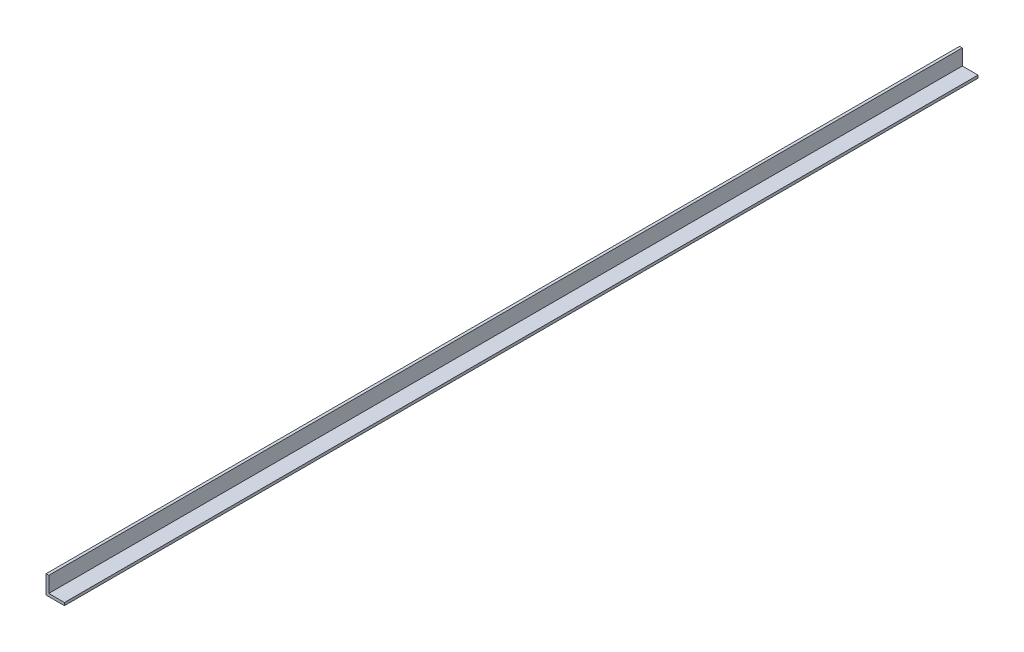
ISO-10303-21;
HEADER;
FILE_DESCRIPTION(('STEP AP214'),'2;1');
FILE_NAME('part.step','',(''),(''),'','','');
FILE_SCHEMA(('AUTOMOTIVE_DESIGN { 1 0 10303 214 1 1 1 1 }'));
ENDSEC;
DATA;
#1=APPLICATION_CONTEXT('core data for automotive mechanical design processes');
#2=APPLICATION_PROTOCOL_DEFINITION('international standard','automotive_design',2000,#1);
#3=PRODUCT_CONTEXT('',#1,'mechanical');
#4=PRODUCT('Part','Part','',(#3));
#5=PRODUCT_RELATED_PRODUCT_CATEGORY('part','',(#4));
#6=PRODUCT_DEFINITION_FORMATION('','',#4);
#7=PRODUCT_DEFINITION_CONTEXT('part definition',#1,'design');
#8=PRODUCT_DEFINITION('design','',#6,#7);
#9=PRODUCT_DEFINITION_SHAPE('','',#8);
#10=(LENGTH_UNIT() NAMED_UNIT(*) SI_UNIT(.MILLI.,.METRE.));
#11=(NAMED_UNIT(*) PLANE_ANGLE_UNIT() SI_UNIT($,.RADIAN.));
#12=(NAMED_UNIT(*) SI_UNIT($,.STERADIAN.) SOLID_ANGLE_UNIT());
#13=UNCERTAINTY_MEASURE_WITH_UNIT(LENGTH_MEASURE(1.E-05),#10,'distance_accuracy_value','');
#14=(GEOMETRIC_REPRESENTATION_CONTEXT(3) GLOBAL_UNCERTAINTY_ASSIGNED_CONTEXT((#13)) GLOBAL_UNIT_ASSIGNED_CONTEXT((#10,
#11,#12)) REPRESENTATION_CONTEXT('',''));
#15=CARTESIAN_POINT('',(0.,0.,0.));
#16=DIRECTION('',(0.,0.,1.));
#17=DIRECTION('',(1.,0.,0.));
#18=AXIS2_PLACEMENT_3D('',#15,#16,#17);
#19=CARTESIAN_POINT('',(3.,20.,990.));
#20=DIRECTION('',(0.,-1.,0.));
#21=DIRECTION('',(0.,0.,-1.));
#22=AXIS2_PLACEMENT_3D('',#19,#20,#21);
#23=PLANE('',#22);
#24=DIRECTION('',(-1.,0.,0.));
#25=VECTOR('',#24,1.);
#26=CARTESIAN_POINT('',(3.,20.,0.));
#27=LINE('',#26,#25);
#28=CARTESIAN_POINT('',(3.,20.,0.));
#29=VERTEX_POINT('',#28);
#30=CARTESIAN_POINT('',(0.,20.,0.));
#31=VERTEX_POINT('',#30);
#32=EDGE_CURVE('E121',#29,#31,#27,.T.);
#33=ORIENTED_EDGE('',*,*,#32,.T.);
#34=DIRECTION('',(0.,0.,-1.));
#35=VECTOR('',#34,1.);
#36=CARTESIAN_POINT('',(0.,20.,990.));
#37=LINE('',#36,#35);
#38=CARTESIAN_POINT('',(0.,20.,990.));
#39=VERTEX_POINT('',#38);
#40=EDGE_CURVE('E11',#39,#31,#37,.T.);
#41=ORIENTED_EDGE('',*,*,#40,.F.);
#42=DIRECTION('',(-1.,0.,0.));
#43=VECTOR('',#42,1.);
#44=CARTESIAN_POINT('',(3.,20.,990.));
#45=LINE('',#44,#43);
#46=CARTESIAN_POINT('',(3.,20.,990.));
#47=VERTEX_POINT('',#46);
#48=EDGE_CURVE('E131',#47,#39,#45,.T.);
#49=ORIENTED_EDGE('',*,*,#48,.F.);
#50=DIRECTION('',(0.,0.,-1.));
#51=VECTOR('',#50,1.);
#52=CARTESIAN_POINT('',(3.,20.,990.));
#53=LINE('',#52,#51);
#54=EDGE_CURVE('E117',#47,#29,#53,.T.);
#55=ORIENTED_EDGE('',*,*,#54,.T.);
#56=EDGE_LOOP('',(#33,#41,#49,#55));
#57=FACE_BOUND('',#56,.T.);
#58=ADVANCED_FACE('F37',(#57),#23,.F.);
#59=CARTESIAN_POINT('',(0.,20.,990.));
#60=DIRECTION('',(1.,0.,0.));
#61=DIRECTION('',(0.,0.,-1.));
#62=AXIS2_PLACEMENT_3D('',#59,#60,#61);
#63=PLANE('',#62);
#64=DIRECTION('',(0.,-1.,0.));
#65=VECTOR('',#64,1.);
#66=CARTESIAN_POINT('',(0.,20.,0.));
#67=LINE('',#66,#65);
#68=CARTESIAN_POINT('',(0.,0.,0.));
#69=VERTEX_POINT('',#68);
#70=EDGE_CURVE('E124',#31,#69,#67,.T.);
#71=ORIENTED_EDGE('',*,*,#70,.T.);
#72=DIRECTION('',(0.,0.,-1.));
#73=VECTOR('',#72,1.);
#74=CARTESIAN_POINT('',(0.,0.,990.));
#75=LINE('',#74,#73);
#76=CARTESIAN_POINT('',(0.,0.,990.));
#77=VERTEX_POINT('',#76);
#78=EDGE_CURVE('E45',#77,#69,#75,.T.);
#79=ORIENTED_EDGE('',*,*,#78,.F.);
#80=DIRECTION('',(0.,-1.,0.));
#81=VECTOR('',#80,1.);
#82=CARTESIAN_POINT('',(0.,20.,990.));
#83=LINE('',#82,#81);
#84=EDGE_CURVE('E90',#39,#77,#83,.T.);
#85=ORIENTED_EDGE('',*,*,#84,.F.);
#86=ORIENTED_EDGE('',*,*,#40,.T.);
#87=EDGE_LOOP('',(#71,#79,#85,#86));
#88=FACE_BOUND('',#87,.T.);
#89=ADVANCED_FACE('F155',(#88),#63,.F.);
#90=CARTESIAN_POINT('',(0.,0.,990.));
#91=DIRECTION('',(0.,1.,0.));
#92=DIRECTION('',(0.,0.,1.));
#93=AXIS2_PLACEMENT_3D('',#90,#91,#92);
#94=PLANE('',#93);
#95=DIRECTION('',(1.,0.,0.));
#96=VECTOR('',#95,1.);
#97=CARTESIAN_POINT('',(0.,0.,0.));
#98=LINE('',#97,#96);
#99=CARTESIAN_POINT('',(20.,0.,0.));
#100=VERTEX_POINT('',#99);
#101=EDGE_CURVE('E126',#69,#100,#98,.T.);
#102=ORIENTED_EDGE('',*,*,#101,.T.);
#103=DIRECTION('',(0.,0.,-1.));
#104=VECTOR('',#103,1.);
#105=CARTESIAN_POINT('',(20.,0.,990.));
#106=LINE('',#105,#104);
#107=CARTESIAN_POINT('',(20.,0.,990.));
#108=VERTEX_POINT('',#107);
#109=EDGE_CURVE('E112',#108,#100,#106,.T.);
#110=ORIENTED_EDGE('',*,*,#109,.F.);
#111=DIRECTION('',(1.,0.,0.));
#112=VECTOR('',#111,1.);
#113=CARTESIAN_POINT('',(0.,0.,990.));
#114=LINE('',#113,#112);
#115=EDGE_CURVE('E103',#77,#108,#114,.T.);
#116=ORIENTED_EDGE('',*,*,#115,.F.);
#117=ORIENTED_EDGE('',*,*,#78,.T.);
#118=EDGE_LOOP('',(#102,#110,#116,#117));
#119=FACE_BOUND('',#118,.T.);
#120=ADVANCED_FACE('F137',(#119),#94,.F.);
#121=CARTESIAN_POINT('',(20.,0.,990.));
#122=DIRECTION('',(-1.,0.,0.));
#123=DIRECTION('',(0.,0.,1.));
#124=AXIS2_PLACEMENT_3D('',#121,#122,#123);
#125=PLANE('',#124);
#126=DIRECTION('',(0.,1.,0.));
#127=VECTOR('',#126,1.);
#128=CARTESIAN_POINT('',(20.,0.,0.));
#129=LINE('',#128,#127);
#130=CARTESIAN_POINT('',(20.,3.,0.));
#131=VERTEX_POINT('',#130);
#132=EDGE_CURVE('E111',#100,#131,#129,.T.);
#133=ORIENTED_EDGE('',*,*,#132,.T.);
#134=DIRECTION('',(0.,0.,-1.));
#135=VECTOR('',#134,1.);
#136=CARTESIAN_POINT('',(20.,3.,990.));
#137=LINE('',#136,#135);
#138=CARTESIAN_POINT('',(20.,3.,990.));
#139=VERTEX_POINT('',#138);
#140=EDGE_CURVE('E108',#139,#131,#137,.T.);
#141=ORIENTED_EDGE('',*,*,#140,.F.);
#142=DIRECTION('',(0.,1.,0.));
#143=VECTOR('',#142,1.);
#144=CARTESIAN_POINT('',(20.,0.,990.));
#145=LINE('',#144,#143);
#146=EDGE_CURVE('E97',#108,#139,#145,.T.);
#147=ORIENTED_EDGE('',*,*,#146,.F.);
#148=ORIENTED_EDGE('',*,*,#109,.T.);
#149=EDGE_LOOP('',(#133,#141,#147,#148));
#150=FACE_BOUND('',#149,.T.);
#151=ADVANCED_FACE('F109',(#150),#125,.F.);
#152=CARTESIAN_POINT('',(20.,3.,990.));
#153=DIRECTION('',(0.,-1.,0.));
#154=DIRECTION('',(1.,0.,0.));
#155=AXIS2_PLACEMENT_3D('',#152,#153,#154);
#156=PLANE('',#155);
#157=DIRECTION('',(-1.,0.,0.));
#158=VECTOR('',#157,1.);
#159=CARTESIAN_POINT('',(20.,3.,0.));
#160=LINE('',#159,#158);
#161=CARTESIAN_POINT('',(3.,3.,0.));
#162=VERTEX_POINT('',#161);
#163=EDGE_CURVE('E76',#131,#162,#160,.T.);
#164=ORIENTED_EDGE('',*,*,#163,.T.);
#165=DIRECTION('',(0.,0.,-1.));
#166=VECTOR('',#165,1.);
#167=CARTESIAN_POINT('',(3.,3.,990.));
#168=LINE('',#167,#166);
#169=CARTESIAN_POINT('',(3.,3.,990.));
#170=VERTEX_POINT('',#169);
#171=EDGE_CURVE('E113',#170,#162,#168,.T.);
#172=ORIENTED_EDGE('',*,*,#171,.F.);
#173=DIRECTION('',(-1.,0.,0.));
#174=VECTOR('',#173,1.);
#175=CARTESIAN_POINT('',(20.,3.,990.));
#176=LINE('',#175,#174);
#177=EDGE_CURVE('E101',#139,#170,#176,.T.);
#178=ORIENTED_EDGE('',*,*,#177,.F.);
#179=ORIENTED_EDGE('',*,*,#140,.T.);
#180=EDGE_LOOP('',(#164,#172,#178,#179));
#181=FACE_BOUND('',#180,.T.);
#182=ADVANCED_FACE('F115',(#181),#156,.F.);
#183=CARTESIAN_POINT('',(3.,3.,990.));
#184=DIRECTION('',(-1.,0.,0.));
#185=DIRECTION('',(0.,-1.,0.));
#186=AXIS2_PLACEMENT_3D('',#183,#184,#185);
#187=PLANE('',#186);
#188=DIRECTION('',(0.,1.,0.));
#189=VECTOR('',#188,1.);
#190=CARTESIAN_POINT('',(3.,3.,0.));
#191=LINE('',#190,#189);
#192=EDGE_CURVE('E82',#162,#29,#191,.T.);
#193=ORIENTED_EDGE('',*,*,#192,.T.);
#194=ORIENTED_EDGE('',*,*,#54,.F.);
#195=DIRECTION('',(0.,1.,0.));
#196=VECTOR('',#195,1.);
#197=CARTESIAN_POINT('',(3.,3.,990.));
#198=LINE('',#197,#196);
#199=EDGE_CURVE('E53',#170,#47,#198,.T.);
#200=ORIENTED_EDGE('',*,*,#199,.F.);
#201=ORIENTED_EDGE('',*,*,#171,.T.);
#202=EDGE_LOOP('',(#193,#194,#200,#201));
#203=FACE_BOUND('',#202,.T.);
#204=ADVANCED_FACE('F144',(#203),#187,.F.);
#205=CARTESIAN_POINT('',(0.,0.,990.));
#206=DIRECTION('',(0.,0.,1.));
#207=DIRECTION('',(1.,0.,0.));
#208=AXIS2_PLACEMENT_3D('',#205,#206,#207);
#209=PLANE('',#208);
#210=ORIENTED_EDGE('',*,*,#48,.T.);
#211=ORIENTED_EDGE('',*,*,#84,.T.);
#212=ORIENTED_EDGE('',*,*,#115,.T.);
#213=ORIENTED_EDGE('',*,*,#146,.T.);
#214=ORIENTED_EDGE('',*,*,#177,.T.);
#215=ORIENTED_EDGE('',*,*,#199,.T.);
#216=EDGE_LOOP('',(#210,#211,#212,#213,#214,#215));
#217=FACE_BOUND('',#216,.T.);
#218=ADVANCED_FACE('F99',(#217),#209,.T.);
#219=CARTESIAN_POINT('',(0.,0.,0.));
#220=DIRECTION('',(0.,0.,1.));
#221=DIRECTION('',(1.,0.,0.));
#222=AXIS2_PLACEMENT_3D('',#219,#220,#221);
#223=PLANE('',#222);
#224=ORIENTED_EDGE('',*,*,#32,.F.);
#225=ORIENTED_EDGE('',*,*,#192,.F.);
#226=ORIENTED_EDGE('',*,*,#163,.F.);
#227=ORIENTED_EDGE('',*,*,#132,.F.);
#228=ORIENTED_EDGE('',*,*,#101,.F.);
#229=ORIENTED_EDGE('',*,*,#70,.F.);
#230=EDGE_LOOP('',(#224,#225,#226,#227,#228,#229));
#231=FACE_BOUND('',#230,.T.);
#232=ADVANCED_FACE('F140',(#231),#223,.F.);
#233=CLOSED_SHELL('',(#58,#89,#120,#151,#182,#204,#218,#232));
#234=MANIFOLD_SOLID_BREP('B2',#233);
#235=ADVANCED_BREP_SHAPE_REPRESENTATION('',(#18,#234),#14);
#236=SHAPE_DEFINITION_REPRESENTATION(#9,#235);
ENDSEC;
END-ISO-10303-21;
